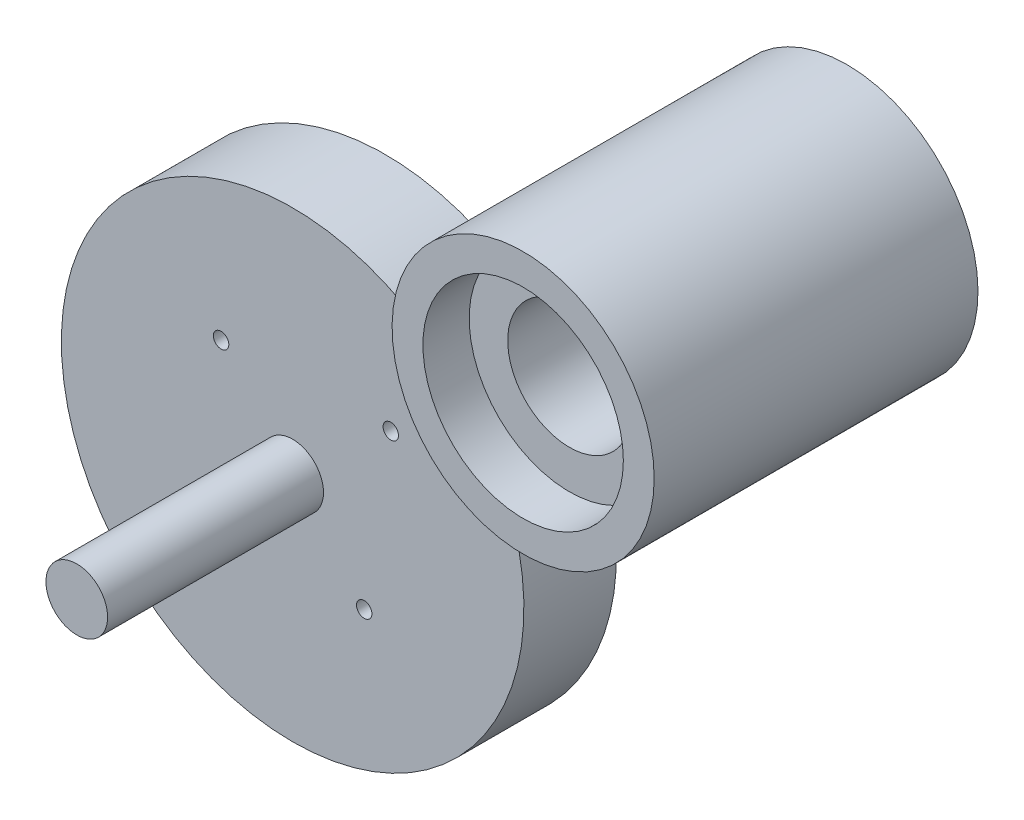
ISO-10303-21;
HEADER;
FILE_DESCRIPTION(('STEP AP214'),'2;1');
FILE_NAME('part.step','',(''),(''),'','','');
FILE_SCHEMA(('AUTOMOTIVE_DESIGN { 1 0 10303 214 1 1 1 1 }'));
ENDSEC;
DATA;
#1=APPLICATION_CONTEXT('core data for automotive mechanical design processes');
#2=APPLICATION_PROTOCOL_DEFINITION('international standard','automotive_design',2000,#1);
#3=PRODUCT_CONTEXT('',#1,'mechanical');
#4=PRODUCT('Part','Part','',(#3));
#5=PRODUCT_RELATED_PRODUCT_CATEGORY('part','',(#4));
#6=PRODUCT_DEFINITION_FORMATION('','',#4);
#7=PRODUCT_DEFINITION_CONTEXT('part definition',#1,'design');
#8=PRODUCT_DEFINITION('design','',#6,#7);
#9=PRODUCT_DEFINITION_SHAPE('','',#8);
#10=(LENGTH_UNIT() NAMED_UNIT(*) SI_UNIT(.MILLI.,.METRE.));
#11=(NAMED_UNIT(*) PLANE_ANGLE_UNIT() SI_UNIT($,.RADIAN.));
#12=(NAMED_UNIT(*) SI_UNIT($,.STERADIAN.) SOLID_ANGLE_UNIT());
#13=UNCERTAINTY_MEASURE_WITH_UNIT(LENGTH_MEASURE(1.E-05),#10,'distance_accuracy_value','');
#14=(GEOMETRIC_REPRESENTATION_CONTEXT(3) GLOBAL_UNCERTAINTY_ASSIGNED_CONTEXT((#13)) GLOBAL_UNIT_ASSIGNED_CONTEXT((#10,
#11,#12)) REPRESENTATION_CONTEXT('',''));
#15=CARTESIAN_POINT('',(0.,0.,0.));
#16=DIRECTION('',(0.,0.,1.));
#17=DIRECTION('',(1.,0.,0.));
#18=AXIS2_PLACEMENT_3D('',#15,#16,#17);
#19=CARTESIAN_POINT('',(26.3142622596346,34.5801926027609,6.));
#20=DIRECTION('',(0.,0.,-1.));
#21=DIRECTION('',(-1.,0.,0.));
#22=AXIS2_PLACEMENT_3D('',#19,#20,#21);
#23=CYLINDRICAL_SURFACE('',#22,6.49999999999987);
#24=CARTESIAN_POINT('',(26.3142622596346,34.5801926027609,0.));
#25=DIRECTION('',(0.,0.,1.));
#26=DIRECTION('',(1.,0.,0.));
#27=AXIS2_PLACEMENT_3D('',#24,#25,#26);
#28=CIRCLE('',#27,6.49999999999987);
#29=CARTESIAN_POINT('',(32.8142622596345,34.5801926027609,0.));
#30=VERTEX_POINT('',#29);
#31=EDGE_CURVE('E169',#30,#30,#28,.T.);
#32=ORIENTED_EDGE('',*,*,#31,.F.);
#33=EDGE_LOOP('',(#32));
#34=FACE_BOUND('',#33,.T.);
#35=CARTESIAN_POINT('',(26.3142622596346,34.5801926027609,3.));
#36=DIRECTION('',(0.,0.,1.));
#37=DIRECTION('',(1.,0.,0.));
#38=AXIS2_PLACEMENT_3D('',#35,#36,#37);
#39=CIRCLE('',#38,6.49999999999987);
#40=CARTESIAN_POINT('',(32.8142622596345,34.5801926027609,3.));
#41=VERTEX_POINT('',#40);
#42=EDGE_CURVE('E122',#41,#41,#39,.T.);
#43=ORIENTED_EDGE('',*,*,#42,.T.);
#44=EDGE_LOOP('',(#43));
#45=FACE_BOUND('',#44,.T.);
#46=ADVANCED_FACE('F49',(#34,#45),#23,.F.);
#47=CARTESIAN_POINT('',(0.,0.,6.));
#48=DIRECTION('',(0.,0.,1.));
#49=DIRECTION('',(1.,0.,0.));
#50=AXIS2_PLACEMENT_3D('',#47,#48,#49);
#51=PLANE('',#50);
#52=DIRECTION('',(-0.662916379618961,0.748693444363506,0.));
#53=VECTOR('',#52,1.);
#54=CARTESIAN_POINT('',(17.7823888424568,15.7450782041237,6.));
#55=LINE('',#54,#53);
#56=CARTESIAN_POINT('',(8.86894245750823,25.8118665356059,6.));
#57=VERTEX_POINT('',#56);
#58=CARTESIAN_POINT('',(15.4981062536978,18.3249320919708,5.99999999999999));
#59=VERTEX_POINT('',#58);
#60=EDGE_CURVE('E64',#57,#59,#55,.F.);
#61=ORIENTED_EDGE('',*,*,#60,.F.);
#62=DIRECTION('',(-0.748693444363506,-0.662916379618961,0.));
#63=VECTOR('',#62,1.);
#64=CARTESIAN_POINT('',(-8.91344638494861,10.0667883314822,6.));
#65=LINE('',#64,#63);
#66=CARTESIAN_POINT('',(3.64006681778769,21.1820579875851,6.));
#67=VERTEX_POINT('',#66);
#68=EDGE_CURVE('E140',#57,#67,#65,.T.);
#69=ORIENTED_EDGE('',*,*,#68,.T.);
#70=CARTESIAN_POINT('',(-3.63347551490446,8.06353741800347,6.));
#71=DIRECTION('',(0.,0.,1.));
#72=DIRECTION('',(1.,0.,0.));
#73=AXIS2_PLACEMENT_3D('',#70,#71,#72);
#74=CIRCLE('',#73,15.);
#75=CARTESIAN_POINT('',(10.2692306139773,13.69512354395,6.));
#76=VERTEX_POINT('',#75);
#77=EDGE_CURVE('E142',#67,#76,#74,.T.);
#78=ORIENTED_EDGE('',*,*,#77,.T.);
#79=DIRECTION('',(-0.748693444363506,-0.662916379618961,0.));
#80=VECTOR('',#79,1.);
#81=CARTESIAN_POINT('',(-2.284282588759,2.57985388784719,6.));
#82=LINE('',#81,#80);
#83=EDGE_CURVE('E69',#59,#76,#82,.T.);
#84=ORIENTED_EDGE('',*,*,#83,.F.);
#85=EDGE_LOOP('',(#61,#69,#78,#84));
#86=FACE_BOUND('',#85,.T.);
#87=CARTESIAN_POINT('',(-9.99736979199425,2.42874819124229,6.));
#88=DIRECTION('',(0.,0.,1.));
#89=DIRECTION('',(1.,0.,0.));
#90=AXIS2_PLACEMENT_3D('',#87,#88,#89);
#91=CIRCLE('',#90,0.500000000000253);
#92=CARTESIAN_POINT('',(-9.497369791994,2.42874819124229,6.));
#93=VERTEX_POINT('',#92);
#94=EDGE_CURVE('E158',#93,#93,#91,.F.);
#95=ORIENTED_EDGE('',*,*,#94,.T.);
#96=EDGE_LOOP('',(#95));
#97=FACE_BOUND('',#96,.T.);
#98=CARTESIAN_POINT('',(-8.27389017223719,13.304391528548,6.));
#99=DIRECTION('',(0.,0.,1.));
#100=DIRECTION('',(1.,0.,0.));
#101=AXIS2_PLACEMENT_3D('',#98,#99,#100);
#102=CIRCLE('',#101,0.499999999999533);
#103=CARTESIAN_POINT('',(-7.77389017223766,13.304391528548,6.));
#104=VERTEX_POINT('',#103);
#105=EDGE_CURVE('E155',#104,#104,#102,.T.);
#106=ORIENTED_EDGE('',*,*,#105,.F.);
#107=EDGE_LOOP('',(#106));
#108=FACE_BOUND('',#107,.T.);
#109=CARTESIAN_POINT('',(2.73041876218534,13.6983266447646,6.));
#110=DIRECTION('',(0.,0.,1.));
#111=DIRECTION('',(1.,0.,0.));
#112=AXIS2_PLACEMENT_3D('',#109,#110,#111);
#113=CIRCLE('',#112,0.499999999999764);
#114=CARTESIAN_POINT('',(3.2304187621851,13.6983266447646,6.));
#115=VERTEX_POINT('',#114);
#116=EDGE_CURVE('E152',#115,#115,#113,.T.);
#117=ORIENTED_EDGE('',*,*,#116,.F.);
#118=EDGE_LOOP('',(#117));
#119=FACE_BOUND('',#118,.T.);
#120=CARTESIAN_POINT('',(1.00693914242865,2.82268330745926,6.));
#121=DIRECTION('',(0.,0.,1.));
#122=DIRECTION('',(1.,0.,0.));
#123=AXIS2_PLACEMENT_3D('',#120,#121,#122);
#124=CIRCLE('',#123,0.5);
#125=CARTESIAN_POINT('',(1.50693914242865,2.82268330745926,6.));
#126=VERTEX_POINT('',#125);
#127=EDGE_CURVE('E149',#126,#126,#124,.F.);
#128=ORIENTED_EDGE('',*,*,#127,.T.);
#129=EDGE_LOOP('',(#128));
#130=FACE_BOUND('',#129,.T.);
#131=CARTESIAN_POINT('',(-3.63347551490446,8.06353741800347,6.));
#132=DIRECTION('',(0.,0.,1.));
#133=DIRECTION('',(1.,0.,0.));
#134=AXIS2_PLACEMENT_3D('',#131,#132,#133);
#135=CIRCLE('',#134,2.);
#136=CARTESIAN_POINT('',(-1.63347551490446,8.06353741800347,6.));
#137=VERTEX_POINT('',#136);
#138=EDGE_CURVE('E146',#137,#137,#135,.T.);
#139=ORIENTED_EDGE('',*,*,#138,.F.);
#140=EDGE_LOOP('',(#139));
#141=FACE_BOUND('',#140,.T.);
#142=ADVANCED_FACE('F195',(#86,#97,#108,#119,#130,#141),#51,.T.);
#143=CARTESIAN_POINT('',(-8.91344638494861,10.0667883314822,6.));
#144=DIRECTION('',(0.662916379618961,-0.748693444363505,0.));
#145=DIRECTION('',(0.748693444363506,0.662916379618961,0.));
#146=AXIS2_PLACEMENT_3D('',#143,#144,#145);
#147=PLANE('',#146);
#148=ORIENTED_EDGE('',*,*,#68,.F.);
#149=DIRECTION('',(-0.606734584085459,-0.537221605050231,-0.585889146120577));
#150=VECTOR('',#149,1.);
#151=CARTESIAN_POINT('',(16.63578608445,32.6888705978172,13.5));
#152=LINE('',#151,#150);
#153=CARTESIAN_POINT('',(17.8532637898703,33.7668630910334,14.6756491091154));
#154=VERTEX_POINT('',#153);
#155=EDGE_CURVE('E114',#154,#57,#152,.T.);
#156=ORIENTED_EDGE('',*,*,#155,.F.);
#157=DIRECTION('',(0.,0.,-1.));
#158=VECTOR('',#157,1.);
#159=CARTESIAN_POINT('',(17.8532637898703,33.7668630910334,6.));
#160=LINE('',#159,#158);
#161=CARTESIAN_POINT('',(17.8532637898703,33.7668630910334,0.));
#162=VERTEX_POINT('',#161);
#163=EDGE_CURVE('E104',#154,#162,#160,.T.);
#164=ORIENTED_EDGE('',*,*,#163,.T.);
#165=DIRECTION('',(-0.748693444363506,-0.662916379618961,0.));
#166=VECTOR('',#165,1.);
#167=CARTESIAN_POINT('',(-8.91344638494861,10.0667883314822,0.));
#168=LINE('',#167,#166);
#169=CARTESIAN_POINT('',(3.64006681778769,21.1820579875851,0.));
#170=VERTEX_POINT('',#169);
#171=EDGE_CURVE('E139',#162,#170,#168,.T.);
#172=ORIENTED_EDGE('',*,*,#171,.T.);
#173=DIRECTION('',(0.,0.,-1.));
#174=VECTOR('',#173,1.);
#175=CARTESIAN_POINT('',(3.64006681778769,21.1820579875851,6.));
#176=LINE('',#175,#174);
#177=EDGE_CURVE('E57',#67,#170,#176,.T.);
#178=ORIENTED_EDGE('',*,*,#177,.F.);
#179=EDGE_LOOP('',(#148,#156,#164,#172,#178));
#180=FACE_BOUND('',#179,.T.);
#181=ADVANCED_FACE('F51',(#180),#147,.F.);
#182=CARTESIAN_POINT('',(-3.63347551490446,8.06353741800347,6.));
#183=DIRECTION('',(0.,0.,-1.));
#184=DIRECTION('',(-1.,0.,0.));
#185=AXIS2_PLACEMENT_3D('',#182,#183,#184);
#186=CYLINDRICAL_SURFACE('',#185,15.);
#187=CARTESIAN_POINT('',(-3.63347551490446,8.06353741800347,0.));
#188=DIRECTION('',(0.,0.,1.));
#189=DIRECTION('',(1.,0.,0.));
#190=AXIS2_PLACEMENT_3D('',#187,#188,#189);
#191=CIRCLE('',#190,15.);
#192=CARTESIAN_POINT('',(10.2692306139773,13.69512354395,0.));
#193=VERTEX_POINT('',#192);
#194=EDGE_CURVE('E163',#170,#193,#191,.T.);
#195=ORIENTED_EDGE('',*,*,#194,.T.);
#196=DIRECTION('',(0.,0.,-1.));
#197=VECTOR('',#196,1.);
#198=CARTESIAN_POINT('',(10.2692306139773,13.69512354395,6.));
#199=LINE('',#198,#197);
#200=EDGE_CURVE('E103',#76,#193,#199,.T.);
#201=ORIENTED_EDGE('',*,*,#200,.F.);
#202=ORIENTED_EDGE('',*,*,#77,.F.);
#203=ORIENTED_EDGE('',*,*,#177,.T.);
#204=EDGE_LOOP('',(#195,#201,#202,#203));
#205=FACE_BOUND('',#204,.T.);
#206=ADVANCED_FACE('F188',(#205),#186,.T.);
#207=CARTESIAN_POINT('',(-2.284282588759,2.57985388784719,6.));
#208=DIRECTION('',(0.662916379618961,-0.748693444363505,0.));
#209=DIRECTION('',(0.748693444363505,0.662916379618961,0.));
#210=AXIS2_PLACEMENT_3D('',#207,#208,#209);
#211=PLANE('',#210);
#212=ORIENTED_EDGE('',*,*,#200,.T.);
#213=DIRECTION('',(-0.748693444363506,-0.662916379618961,0.));
#214=VECTOR('',#213,1.);
#215=CARTESIAN_POINT('',(-2.284282588759,2.57985388784719,0.));
#216=LINE('',#215,#214);
#217=CARTESIAN_POINT('',(24.4824275860599,26.2799286473984,0.));
#218=VERTEX_POINT('',#217);
#219=EDGE_CURVE('E100',#218,#193,#216,.T.);
#220=ORIENTED_EDGE('',*,*,#219,.F.);
#221=DIRECTION('',(0.,0.,-1.));
#222=VECTOR('',#221,1.);
#223=CARTESIAN_POINT('',(24.4824275860599,26.2799286473984,6.));
#224=LINE('',#223,#222);
#225=CARTESIAN_POINT('',(24.4824275860599,26.2799286473984,14.6756491091154));
#226=VERTEX_POINT('',#225);
#227=EDGE_CURVE('E94',#226,#218,#224,.T.);
#228=ORIENTED_EDGE('',*,*,#227,.F.);
#229=DIRECTION('',(-0.606734584085459,-0.537221605050231,-0.585889146120577));
#230=VECTOR('',#229,1.);
#231=CARTESIAN_POINT('',(23.2649498806396,25.2019361541822,13.5));
#232=LINE('',#231,#230);
#233=EDGE_CURVE('E98',#226,#59,#232,.T.);
#234=ORIENTED_EDGE('',*,*,#233,.T.);
#235=ORIENTED_EDGE('',*,*,#83,.T.);
#236=EDGE_LOOP('',(#212,#220,#228,#234,#235));
#237=FACE_BOUND('',#236,.T.);
#238=ADVANCED_FACE('F96',(#237),#211,.T.);
#239=CARTESIAN_POINT('',(-8.27389017223719,13.304391528548,6.));
#240=DIRECTION('',(0.,0.,-1.));
#241=DIRECTION('',(-1.,0.,0.));
#242=AXIS2_PLACEMENT_3D('',#239,#240,#241);
#243=CYLINDRICAL_SURFACE('',#242,0.499999999999533);
#244=ORIENTED_EDGE('',*,*,#105,.T.);
#245=EDGE_LOOP('',(#244));
#246=FACE_BOUND('',#245,.T.);
#247=CARTESIAN_POINT('',(-8.27389017223719,13.304391528548,0.));
#248=DIRECTION('',(0.,0.,1.));
#249=DIRECTION('',(1.,0.,0.));
#250=AXIS2_PLACEMENT_3D('',#247,#248,#249);
#251=CIRCLE('',#250,0.499999999999533);
#252=CARTESIAN_POINT('',(-7.77389017223766,13.304391528548,0.));
#253=VERTEX_POINT('',#252);
#254=EDGE_CURVE('E178',#253,#253,#251,.T.);
#255=ORIENTED_EDGE('',*,*,#254,.F.);
#256=EDGE_LOOP('',(#255));
#257=FACE_BOUND('',#256,.T.);
#258=ADVANCED_FACE('F303',(#246,#257),#243,.F.);
#259=CARTESIAN_POINT('',(2.73041876218534,13.6983266447646,6.));
#260=DIRECTION('',(0.,0.,-1.));
#261=DIRECTION('',(-1.,0.,0.));
#262=AXIS2_PLACEMENT_3D('',#259,#260,#261);
#263=CYLINDRICAL_SURFACE('',#262,0.499999999999764);
#264=ORIENTED_EDGE('',*,*,#116,.T.);
#265=EDGE_LOOP('',(#264));
#266=FACE_BOUND('',#265,.T.);
#267=CARTESIAN_POINT('',(2.73041876218534,13.6983266447646,0.));
#268=DIRECTION('',(0.,0.,1.));
#269=DIRECTION('',(1.,0.,0.));
#270=AXIS2_PLACEMENT_3D('',#267,#268,#269);
#271=CIRCLE('',#270,0.499999999999764);
#272=CARTESIAN_POINT('',(3.2304187621851,13.6983266447646,0.));
#273=VERTEX_POINT('',#272);
#274=EDGE_CURVE('E175',#273,#273,#271,.T.);
#275=ORIENTED_EDGE('',*,*,#274,.F.);
#276=EDGE_LOOP('',(#275));
#277=FACE_BOUND('',#276,.T.);
#278=ADVANCED_FACE('F243',(#266,#277),#263,.F.);
#279=CARTESIAN_POINT('',(1.00693914242865,2.82268330745926,6.));
#280=DIRECTION('',(0.,0.,-1.));
#281=DIRECTION('',(-1.,0.,0.));
#282=AXIS2_PLACEMENT_3D('',#279,#280,#281);
#283=CYLINDRICAL_SURFACE('',#282,0.5);
#284=ORIENTED_EDGE('',*,*,#127,.F.);
#285=EDGE_LOOP('',(#284));
#286=FACE_BOUND('',#285,.T.);
#287=CARTESIAN_POINT('',(1.00693914242865,2.82268330745926,0.));
#288=DIRECTION('',(0.,0.,1.));
#289=DIRECTION('',(1.,0.,0.));
#290=AXIS2_PLACEMENT_3D('',#287,#288,#289);
#291=CIRCLE('',#290,0.5);
#292=CARTESIAN_POINT('',(1.50693914242865,2.82268330745926,0.));
#293=VERTEX_POINT('',#292);
#294=EDGE_CURVE('E172',#293,#293,#291,.F.);
#295=ORIENTED_EDGE('',*,*,#294,.T.);
#296=EDGE_LOOP('',(#295));
#297=FACE_BOUND('',#296,.T.);
#298=ADVANCED_FACE('F236',(#286,#297),#283,.F.);
#299=CARTESIAN_POINT('',(26.3142622596346,34.5801926027609,18.));
#300=DIRECTION('',(0.,0.,1.));
#301=DIRECTION('',(1.,0.,0.));
#302=AXIS2_PLACEMENT_3D('',#299,#300,#301);
#303=CIRCLE('',#302,6.49999999999987);
#304=CARTESIAN_POINT('',(32.8142622596345,34.5801926027609,18.));
#305=VERTEX_POINT('',#304);
#306=EDGE_CURVE('E13',#305,#305,#303,.T.);
#307=ORIENTED_EDGE('',*,*,#306,.F.);
#308=EDGE_LOOP('',(#307));
#309=FACE_BOUND('',#308,.T.);
#310=CARTESIAN_POINT('',(26.3142622596346,34.5801926027609,21.));
#311=DIRECTION('',(0.,0.,1.));
#312=DIRECTION('',(1.,0.,0.));
#313=AXIS2_PLACEMENT_3D('',#310,#311,#312);
#314=CIRCLE('',#313,6.49999999999987);
#315=CARTESIAN_POINT('',(32.8142622596345,34.5801926027609,21.));
#316=VERTEX_POINT('',#315);
#317=EDGE_CURVE('E128',#316,#316,#314,.T.);
#318=ORIENTED_EDGE('',*,*,#317,.T.);
#319=EDGE_LOOP('',(#318));
#320=FACE_BOUND('',#319,.T.);
#321=ADVANCED_FACE('F228',(#309,#320),#23,.F.);
#322=CARTESIAN_POINT('',(26.3142622596346,34.5801926027609,6.));
#323=DIRECTION('',(0.,0.,-1.));
#324=DIRECTION('',(-1.,0.,0.));
#325=AXIS2_PLACEMENT_3D('',#322,#323,#324);
#326=CYLINDRICAL_SURFACE('',#325,8.50000000000006);
#327=CARTESIAN_POINT('',(26.3142622596346,34.5801926027609,0.));
#328=DIRECTION('',(0.,0.,1.));
#329=DIRECTION('',(1.,0.,0.));
#330=AXIS2_PLACEMENT_3D('',#327,#328,#329);
#331=CIRCLE('',#330,8.50000000000006);
#332=EDGE_CURVE('E167',#218,#162,#331,.T.);
#333=ORIENTED_EDGE('',*,*,#332,.T.);
#334=ORIENTED_EDGE('',*,*,#163,.F.);
#335=CARTESIAN_POINT('',(26.3142622596346,34.5801926027609,19.6452514522901));
#336=DIRECTION('',(0.438651362824208,0.388395511604297,-0.810391207046388));
#337=DIRECTION('',(-0.606734584085459,-0.537221605050231,-0.585889146120577));
#338=AXIS2_PLACEMENT_3D('',#335,#336,#337);
#339=ELLIPSE('',#338,10.4887613859728,8.50000000000006);
#340=EDGE_CURVE('E107',#154,#226,#339,.F.);
#341=ORIENTED_EDGE('',*,*,#340,.T.);
#342=ORIENTED_EDGE('',*,*,#227,.T.);
#343=EDGE_LOOP('',(#333,#334,#341,#342));
#344=FACE_BOUND('',#343,.T.);
#345=CARTESIAN_POINT('',(26.3142622596346,34.5801926027609,21.));
#346=DIRECTION('',(0.,0.,1.));
#347=DIRECTION('',(1.,0.,0.));
#348=AXIS2_PLACEMENT_3D('',#345,#346,#347);
#349=CIRCLE('',#348,8.50000000000006);
#350=CARTESIAN_POINT('',(34.8142622596347,34.5801926027609,21.));
#351=VERTEX_POINT('',#350);
#352=EDGE_CURVE('E131',#351,#351,#349,.T.);
#353=ORIENTED_EDGE('',*,*,#352,.F.);
#354=EDGE_LOOP('',(#353));
#355=FACE_BOUND('',#354,.T.);
#356=ADVANCED_FACE('F108',(#344,#355),#326,.T.);
#357=CARTESIAN_POINT('',(-9.99736979199425,2.42874819124229,6.));
#358=DIRECTION('',(0.,0.,-1.));
#359=DIRECTION('',(-1.,0.,0.));
#360=AXIS2_PLACEMENT_3D('',#357,#358,#359);
#361=CYLINDRICAL_SURFACE('',#360,0.500000000000253);
#362=ORIENTED_EDGE('',*,*,#94,.F.);
#363=EDGE_LOOP('',(#362));
#364=FACE_BOUND('',#363,.T.);
#365=CARTESIAN_POINT('',(-9.99736979199425,2.42874819124229,0.));
#366=DIRECTION('',(0.,0.,1.));
#367=DIRECTION('',(1.,0.,0.));
#368=AXIS2_PLACEMENT_3D('',#365,#366,#367);
#369=CIRCLE('',#368,0.500000000000253);
#370=CARTESIAN_POINT('',(-9.497369791994,2.42874819124229,0.));
#371=VERTEX_POINT('',#370);
#372=EDGE_CURVE('E143',#371,#371,#369,.F.);
#373=ORIENTED_EDGE('',*,*,#372,.T.);
#374=EDGE_LOOP('',(#373));
#375=FACE_BOUND('',#374,.T.);
#376=ADVANCED_FACE('F242',(#364,#375),#361,.F.);
#377=CARTESIAN_POINT('',(0.,0.,0.));
#378=DIRECTION('',(0.,0.,1.));
#379=DIRECTION('',(1.,0.,0.));
#380=AXIS2_PLACEMENT_3D('',#377,#378,#379);
#381=PLANE('',#380);
#382=ORIENTED_EDGE('',*,*,#31,.T.);
#383=EDGE_LOOP('',(#382));
#384=FACE_BOUND('',#383,.T.);
#385=ORIENTED_EDGE('',*,*,#194,.F.);
#386=ORIENTED_EDGE('',*,*,#171,.F.);
#387=ORIENTED_EDGE('',*,*,#332,.F.);
#388=ORIENTED_EDGE('',*,*,#219,.T.);
#389=EDGE_LOOP('',(#385,#386,#387,#388));
#390=FACE_BOUND('',#389,.T.);
#391=ORIENTED_EDGE('',*,*,#294,.F.);
#392=EDGE_LOOP('',(#391));
#393=FACE_BOUND('',#392,.T.);
#394=ORIENTED_EDGE('',*,*,#274,.T.);
#395=EDGE_LOOP('',(#394));
#396=FACE_BOUND('',#395,.T.);
#397=ORIENTED_EDGE('',*,*,#254,.T.);
#398=EDGE_LOOP('',(#397));
#399=FACE_BOUND('',#398,.T.);
#400=ORIENTED_EDGE('',*,*,#372,.F.);
#401=EDGE_LOOP('',(#400));
#402=FACE_BOUND('',#401,.T.);
#403=ADVANCED_FACE('F193',(#384,#390,#393,#396,#399,#402),#381,.F.);
#404=CARTESIAN_POINT('',(-3.63347551490446,8.06353741800347,20.));
#405=DIRECTION('',(0.,0.,-1.));
#406=DIRECTION('',(-1.,0.,0.));
#407=AXIS2_PLACEMENT_3D('',#404,#405,#406);
#408=CYLINDRICAL_SURFACE('',#407,2.);
#409=ORIENTED_EDGE('',*,*,#138,.T.);
#410=EDGE_LOOP('',(#409));
#411=FACE_BOUND('',#410,.T.);
#412=CARTESIAN_POINT('',(-3.63347551490446,8.06353741800347,20.));
#413=DIRECTION('',(0.,0.,1.));
#414=DIRECTION('',(1.,0.,0.));
#415=AXIS2_PLACEMENT_3D('',#412,#413,#414);
#416=CIRCLE('',#415,2.);
#417=CARTESIAN_POINT('',(-1.63347551490446,8.06353741800347,20.));
#418=VERTEX_POINT('',#417);
#419=EDGE_CURVE('E134',#418,#418,#416,.T.);
#420=ORIENTED_EDGE('',*,*,#419,.F.);
#421=EDGE_LOOP('',(#420));
#422=FACE_BOUND('',#421,.T.);
#423=ADVANCED_FACE('F209',(#411,#422),#408,.T.);
#424=CARTESIAN_POINT('',(0.,0.,20.));
#425=DIRECTION('',(0.,0.,1.));
#426=DIRECTION('',(1.,0.,0.));
#427=AXIS2_PLACEMENT_3D('',#424,#425,#426);
#428=PLANE('',#427);
#429=ORIENTED_EDGE('',*,*,#419,.T.);
#430=EDGE_LOOP('',(#429));
#431=FACE_BOUND('',#430,.T.);
#432=ADVANCED_FACE('F212',(#431),#428,.T.);
#433=CARTESIAN_POINT('',(0.,0.,21.));
#434=DIRECTION('',(0.,0.,1.));
#435=DIRECTION('',(1.,0.,0.));
#436=AXIS2_PLACEMENT_3D('',#433,#434,#435);
#437=PLANE('',#436);
#438=ORIENTED_EDGE('',*,*,#317,.F.);
#439=EDGE_LOOP('',(#438));
#440=FACE_BOUND('',#439,.T.);
#441=ORIENTED_EDGE('',*,*,#352,.T.);
#442=EDGE_LOOP('',(#441));
#443=FACE_BOUND('',#442,.T.);
#444=ADVANCED_FACE('F217',(#440,#443),#437,.T.);
#445=CARTESIAN_POINT('',(26.3142622596346,34.5801926027609,39.3847763108499));
#446=DIRECTION('',(0.,0.,-1.));
#447=DIRECTION('',(-1.,0.,0.));
#448=AXIS2_PLACEMENT_3D('',#445,#446,#447);
#449=CYLINDRICAL_SURFACE('',#448,3.99999999999999);
#450=CARTESIAN_POINT('',(26.3142622596346,34.5801926027609,18.));
#451=DIRECTION('',(0.,0.,1.));
#452=DIRECTION('',(1.,0.,0.));
#453=AXIS2_PLACEMENT_3D('',#450,#451,#452);
#454=CIRCLE('',#453,3.99999999999999);
#455=CARTESIAN_POINT('',(30.3142622596346,34.5801926027609,18.));
#456=VERTEX_POINT('',#455);
#457=EDGE_CURVE('E121',#456,#456,#454,.T.);
#458=ORIENTED_EDGE('',*,*,#457,.T.);
#459=EDGE_LOOP('',(#458));
#460=FACE_BOUND('',#459,.T.);
#461=CARTESIAN_POINT('',(26.3142622596346,34.5801926027609,3.));
#462=DIRECTION('',(0.,0.,1.));
#463=DIRECTION('',(1.,0.,0.));
#464=AXIS2_PLACEMENT_3D('',#461,#462,#463);
#465=CIRCLE('',#464,3.99999999999999);
#466=CARTESIAN_POINT('',(30.3142622596346,34.5801926027609,3.));
#467=VERTEX_POINT('',#466);
#468=EDGE_CURVE('E125',#467,#467,#465,.T.);
#469=ORIENTED_EDGE('',*,*,#468,.F.);
#470=EDGE_LOOP('',(#469));
#471=FACE_BOUND('',#470,.T.);
#472=ADVANCED_FACE('F222',(#460,#471),#449,.F.);
#473=CARTESIAN_POINT('',(0.,0.,3.));
#474=DIRECTION('',(0.,0.,1.));
#475=DIRECTION('',(1.,0.,0.));
#476=AXIS2_PLACEMENT_3D('',#473,#474,#475);
#477=PLANE('',#476);
#478=ORIENTED_EDGE('',*,*,#42,.F.);
#479=EDGE_LOOP('',(#478));
#480=FACE_BOUND('',#479,.T.);
#481=ORIENTED_EDGE('',*,*,#468,.T.);
#482=EDGE_LOOP('',(#481));
#483=FACE_BOUND('',#482,.T.);
#484=ADVANCED_FACE('F253',(#480,#483),#477,.F.);
#485=CARTESIAN_POINT('',(0.,0.,18.));
#486=DIRECTION('',(0.,0.,1.));
#487=DIRECTION('',(1.,0.,0.));
#488=AXIS2_PLACEMENT_3D('',#485,#486,#487);
#489=PLANE('',#488);
#490=ORIENTED_EDGE('',*,*,#457,.F.);
#491=EDGE_LOOP('',(#490));
#492=FACE_BOUND('',#491,.T.);
#493=ORIENTED_EDGE('',*,*,#306,.T.);
#494=EDGE_LOOP('',(#493));
#495=FACE_BOUND('',#494,.T.);
#496=ADVANCED_FACE('F251',(#492,#495),#489,.T.);
#497=CARTESIAN_POINT('',(19.9503679825448,28.9454033759997,13.5));
#498=DIRECTION('',(0.438651362824208,0.388395511604297,-0.810391207046388));
#499=DIRECTION('',(-0.606734584085459,-0.537221605050231,-0.585889146120577));
#500=AXIS2_PLACEMENT_3D('',#497,#498,#499);
#501=PLANE('',#500);
#502=ORIENTED_EDGE('',*,*,#155,.T.);
#503=ORIENTED_EDGE('',*,*,#60,.T.);
#504=ORIENTED_EDGE('',*,*,#233,.F.);
#505=ORIENTED_EDGE('',*,*,#340,.F.);
#506=EDGE_LOOP('',(#502,#503,#504,#505));
#507=FACE_BOUND('',#506,.T.);
#508=ADVANCED_FACE('F116',(#507),#501,.F.);
#509=CLOSED_SHELL('',(#46,#142,#181,#206,#238,#258,#278,#298,#321,#356,#376,#403,#423,#432,#444,
#472,#484,#496,#508));
#510=MANIFOLD_SOLID_BREP('B2',#509);
#511=ADVANCED_BREP_SHAPE_REPRESENTATION('',(#18,#510),#14);
#512=SHAPE_DEFINITION_REPRESENTATION(#9,#511);
ENDSEC;
END-ISO-10303-21;
